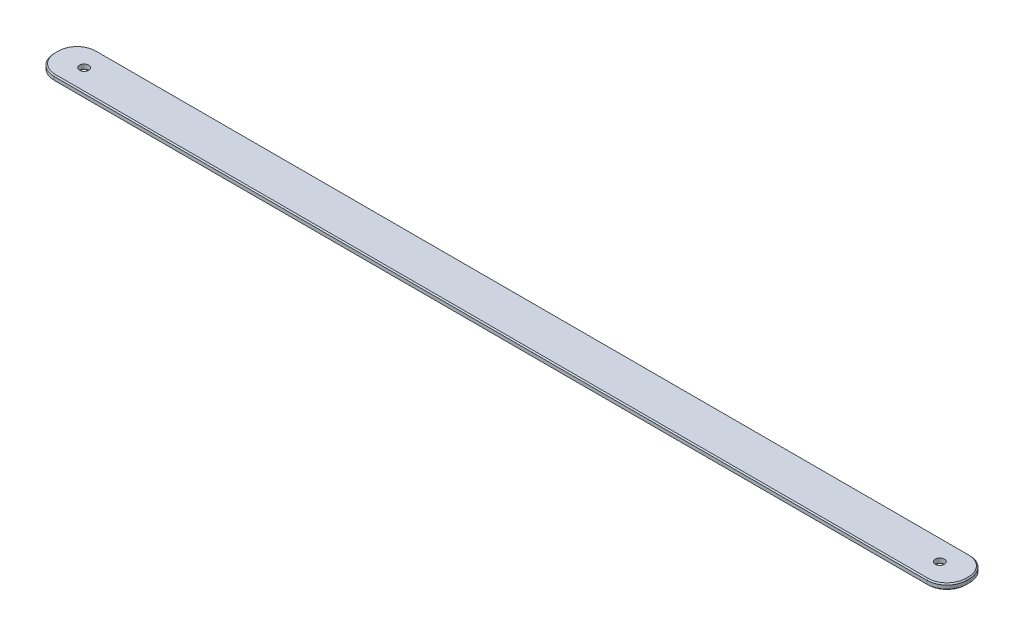
ISO-10303-21;
HEADER;
FILE_DESCRIPTION(('STEP AP214'),'2;1');
FILE_NAME('part.step','',(''),(''),'','','');
FILE_SCHEMA(('AUTOMOTIVE_DESIGN { 1 0 10303 214 1 1 1 1 }'));
ENDSEC;
DATA;
#1=APPLICATION_CONTEXT('core data for automotive mechanical design processes');
#2=APPLICATION_PROTOCOL_DEFINITION('international standard','automotive_design',2000,#1);
#3=PRODUCT_CONTEXT('',#1,'mechanical');
#4=PRODUCT('Part','Part','',(#3));
#5=PRODUCT_RELATED_PRODUCT_CATEGORY('part','',(#4));
#6=PRODUCT_DEFINITION_FORMATION('','',#4);
#7=PRODUCT_DEFINITION_CONTEXT('part definition',#1,'design');
#8=PRODUCT_DEFINITION('design','',#6,#7);
#9=PRODUCT_DEFINITION_SHAPE('','',#8);
#10=(LENGTH_UNIT() NAMED_UNIT(*) SI_UNIT(.MILLI.,.METRE.));
#11=(NAMED_UNIT(*) PLANE_ANGLE_UNIT() SI_UNIT($,.RADIAN.));
#12=(NAMED_UNIT(*) SI_UNIT($,.STERADIAN.) SOLID_ANGLE_UNIT());
#13=UNCERTAINTY_MEASURE_WITH_UNIT(LENGTH_MEASURE(1.E-05),#10,'distance_accuracy_value','');
#14=(GEOMETRIC_REPRESENTATION_CONTEXT(3) GLOBAL_UNCERTAINTY_ASSIGNED_CONTEXT((#13)) GLOBAL_UNIT_ASSIGNED_CONTEXT((#10,
#11,#12)) REPRESENTATION_CONTEXT('',''));
#15=CARTESIAN_POINT('',(0.,0.,0.));
#16=DIRECTION('',(0.,0.,1.));
#17=DIRECTION('',(1.,0.,0.));
#18=AXIS2_PLACEMENT_3D('',#15,#16,#17);
#19=CARTESIAN_POINT('',(0.,2.,0.));
#20=DIRECTION('',(1.,0.,0.));
#21=DIRECTION('',(0.,0.,-1.));
#22=AXIS2_PLACEMENT_3D('',#19,#20,#21);
#23=PLANE('',#22);
#24=DIRECTION('',(0.,-1.,0.));
#25=VECTOR('',#24,1.);
#26=CARTESIAN_POINT('',(0.,2.,-8.));
#27=LINE('',#26,#25);
#28=CARTESIAN_POINT('',(0.,1.59999999999999,-8.));
#29=VERTEX_POINT('',#28);
#30=CARTESIAN_POINT('',(0.,0.400000000000011,-8.));
#31=VERTEX_POINT('',#30);
#32=EDGE_CURVE('E301',#29,#31,#27,.T.);
#33=ORIENTED_EDGE('',*,*,#32,.T.);
#34=DIRECTION('',(0.,0.,1.));
#35=VECTOR('',#34,1.);
#36=CARTESIAN_POINT('',(0.,0.400000000000011,-7.));
#37=LINE('',#36,#35);
#38=CARTESIAN_POINT('',(0.,0.400000000000011,-7.));
#39=VERTEX_POINT('',#38);
#40=EDGE_CURVE('E192',#31,#39,#37,.T.);
#41=ORIENTED_EDGE('',*,*,#40,.T.);
#42=DIRECTION('',(0.,-1.,0.));
#43=VECTOR('',#42,1.);
#44=CARTESIAN_POINT('',(0.,2.,-7.));
#45=LINE('',#44,#43);
#46=CARTESIAN_POINT('',(0.,1.59999999999999,-7.));
#47=VERTEX_POINT('',#46);
#48=EDGE_CURVE('E310',#39,#47,#45,.F.);
#49=ORIENTED_EDGE('',*,*,#48,.T.);
#50=DIRECTION('',(0.,0.,-1.));
#51=VECTOR('',#50,1.);
#52=CARTESIAN_POINT('',(0.,1.59999999999999,0.));
#53=LINE('',#52,#51);
#54=EDGE_CURVE('E190',#47,#29,#53,.T.);
#55=ORIENTED_EDGE('',*,*,#54,.T.);
#56=EDGE_LOOP('',(#33,#41,#49,#55));
#57=FACE_BOUND('',#56,.T.);
#58=ADVANCED_FACE('F37',(#57),#23,.F.);
#59=CARTESIAN_POINT('',(0.,2.,0.));
#60=DIRECTION('',(0.,0.,-1.));
#61=DIRECTION('',(-1.,0.,0.));
#62=AXIS2_PLACEMENT_3D('',#59,#60,#61);
#63=PLANE('',#62);
#64=DIRECTION('',(0.,-1.,0.));
#65=VECTOR('',#64,1.);
#66=CARTESIAN_POINT('',(7.,2.,0.));
#67=LINE('',#66,#65);
#68=CARTESIAN_POINT('',(7.,1.59999999999999,0.));
#69=VERTEX_POINT('',#68);
#70=CARTESIAN_POINT('',(7.,0.400000000000011,0.));
#71=VERTEX_POINT('',#70);
#72=EDGE_CURVE('E290',#69,#71,#67,.T.);
#73=ORIENTED_EDGE('',*,*,#72,.T.);
#74=DIRECTION('',(1.,0.,0.));
#75=VECTOR('',#74,1.);
#76=CARTESIAN_POINT('',(313.,0.400000000000011,0.));
#77=LINE('',#76,#75);
#78=CARTESIAN_POINT('',(313.,0.400000000000011,0.));
#79=VERTEX_POINT('',#78);
#80=EDGE_CURVE('E200',#71,#79,#77,.T.);
#81=ORIENTED_EDGE('',*,*,#80,.T.);
#82=DIRECTION('',(0.,-1.,0.));
#83=VECTOR('',#82,1.);
#84=CARTESIAN_POINT('',(313.,2.,0.));
#85=LINE('',#84,#83);
#86=CARTESIAN_POINT('',(313.,1.59999999999999,0.));
#87=VERTEX_POINT('',#86);
#88=EDGE_CURVE('E293',#79,#87,#85,.F.);
#89=ORIENTED_EDGE('',*,*,#88,.T.);
#90=DIRECTION('',(-1.,0.,0.));
#91=VECTOR('',#90,1.);
#92=CARTESIAN_POINT('',(0.,1.59999999999999,0.));
#93=LINE('',#92,#91);
#94=EDGE_CURVE('E198',#87,#69,#93,.T.);
#95=ORIENTED_EDGE('',*,*,#94,.T.);
#96=EDGE_LOOP('',(#73,#81,#89,#95));
#97=FACE_BOUND('',#96,.T.);
#98=ADVANCED_FACE('F289',(#97),#63,.F.);
#99=CARTESIAN_POINT('',(320.,2.,0.));
#100=DIRECTION('',(-1.,0.,0.));
#101=DIRECTION('',(0.,0.,1.));
#102=AXIS2_PLACEMENT_3D('',#99,#100,#101);
#103=PLANE('',#102);
#104=DIRECTION('',(0.,-1.,0.));
#105=VECTOR('',#104,1.);
#106=CARTESIAN_POINT('',(320.,2.,-7.));
#107=LINE('',#106,#105);
#108=CARTESIAN_POINT('',(320.,1.59999999999999,-7.));
#109=VERTEX_POINT('',#108);
#110=CARTESIAN_POINT('',(320.,0.400000000000011,-7.));
#111=VERTEX_POINT('',#110);
#112=EDGE_CURVE('E304',#109,#111,#107,.T.);
#113=ORIENTED_EDGE('',*,*,#112,.T.);
#114=DIRECTION('',(0.,0.,-1.));
#115=VECTOR('',#114,1.);
#116=CARTESIAN_POINT('',(320.,0.400000000000011,-8.));
#117=LINE('',#116,#115);
#118=CARTESIAN_POINT('',(320.,0.400000000000011,-8.));
#119=VERTEX_POINT('',#118);
#120=EDGE_CURVE('E208',#111,#119,#117,.T.);
#121=ORIENTED_EDGE('',*,*,#120,.T.);
#122=DIRECTION('',(0.,-1.,0.));
#123=VECTOR('',#122,1.);
#124=CARTESIAN_POINT('',(320.,2.,-8.));
#125=LINE('',#124,#123);
#126=CARTESIAN_POINT('',(320.,1.59999999999999,-8.));
#127=VERTEX_POINT('',#126);
#128=EDGE_CURVE('E299',#119,#127,#125,.F.);
#129=ORIENTED_EDGE('',*,*,#128,.T.);
#130=DIRECTION('',(0.,0.,1.));
#131=VECTOR('',#130,1.);
#132=CARTESIAN_POINT('',(320.,1.59999999999999,0.));
#133=LINE('',#132,#131);
#134=EDGE_CURVE('E206',#127,#109,#133,.T.);
#135=ORIENTED_EDGE('',*,*,#134,.T.);
#136=EDGE_LOOP('',(#113,#121,#129,#135));
#137=FACE_BOUND('',#136,.T.);
#138=ADVANCED_FACE('F367',(#137),#103,.F.);
#139=CARTESIAN_POINT('',(0.,2.,-15.));
#140=DIRECTION('',(0.,0.,1.));
#141=DIRECTION('',(1.,0.,0.));
#142=AXIS2_PLACEMENT_3D('',#139,#140,#141);
#143=PLANE('',#142);
#144=DIRECTION('',(0.,-1.,0.));
#145=VECTOR('',#144,1.);
#146=CARTESIAN_POINT('',(313.,2.,-15.));
#147=LINE('',#146,#145);
#148=CARTESIAN_POINT('',(313.,1.59999999999999,-15.));
#149=VERTEX_POINT('',#148);
#150=CARTESIAN_POINT('',(313.,0.400000000000011,-15.));
#151=VERTEX_POINT('',#150);
#152=EDGE_CURVE('E352',#149,#151,#147,.T.);
#153=ORIENTED_EDGE('',*,*,#152,.T.);
#154=DIRECTION('',(-1.,0.,0.));
#155=VECTOR('',#154,1.);
#156=CARTESIAN_POINT('',(7.,0.400000000000011,-15.));
#157=LINE('',#156,#155);
#158=CARTESIAN_POINT('',(7.,0.400000000000011,-15.));
#159=VERTEX_POINT('',#158);
#160=EDGE_CURVE('E217',#151,#159,#157,.T.);
#161=ORIENTED_EDGE('',*,*,#160,.T.);
#162=DIRECTION('',(0.,-1.,0.));
#163=VECTOR('',#162,1.);
#164=CARTESIAN_POINT('',(7.,2.,-15.));
#165=LINE('',#164,#163);
#166=CARTESIAN_POINT('',(7.,1.59999999999999,-15.));
#167=VERTEX_POINT('',#166);
#168=EDGE_CURVE('E339',#159,#167,#165,.F.);
#169=ORIENTED_EDGE('',*,*,#168,.T.);
#170=DIRECTION('',(1.,0.,0.));
#171=VECTOR('',#170,1.);
#172=CARTESIAN_POINT('',(0.,1.59999999999999,-15.));
#173=LINE('',#172,#171);
#174=EDGE_CURVE('E214',#167,#149,#173,.T.);
#175=ORIENTED_EDGE('',*,*,#174,.T.);
#176=EDGE_LOOP('',(#153,#161,#169,#175));
#177=FACE_BOUND('',#176,.T.);
#178=ADVANCED_FACE('F350',(#177),#143,.F.);
#179=CARTESIAN_POINT('',(0.,2.,0.));
#180=DIRECTION('',(0.,-1.,0.));
#181=DIRECTION('',(0.,0.,-1.));
#182=AXIS2_PLACEMENT_3D('',#179,#180,#181);
#183=PLANE('',#182);
#184=CARTESIAN_POINT('',(313.,2.,-8.));
#185=DIRECTION('',(0.,-1.,0.));
#186=DIRECTION('',(0.,0.,-1.));
#187=AXIS2_PLACEMENT_3D('',#184,#185,#186);
#188=CIRCLE('',#187,6.59999999999999);
#189=CARTESIAN_POINT('',(319.6,2.,-8.));
#190=VERTEX_POINT('',#189);
#191=CARTESIAN_POINT('',(313.,2.,-14.6));
#192=VERTEX_POINT('',#191);
#193=EDGE_CURVE('E62',#190,#192,#188,.F.);
#194=ORIENTED_EDGE('',*,*,#193,.T.);
#195=DIRECTION('',(-1.,0.,0.));
#196=VECTOR('',#195,1.);
#197=CARTESIAN_POINT('',(0.,2.,-14.6));
#198=LINE('',#197,#196);
#199=CARTESIAN_POINT('',(7.,2.,-14.6));
#200=VERTEX_POINT('',#199);
#201=EDGE_CURVE('E11',#192,#200,#198,.T.);
#202=ORIENTED_EDGE('',*,*,#201,.T.);
#203=CARTESIAN_POINT('',(7.,2.,-8.));
#204=DIRECTION('',(0.,-1.,0.));
#205=DIRECTION('',(0.,0.,-1.));
#206=AXIS2_PLACEMENT_3D('',#203,#204,#205);
#207=CIRCLE('',#206,6.59999999999999);
#208=CARTESIAN_POINT('',(0.400000000000011,2.,-8.));
#209=VERTEX_POINT('',#208);
#210=EDGE_CURVE('E47',#200,#209,#207,.F.);
#211=ORIENTED_EDGE('',*,*,#210,.T.);
#212=DIRECTION('',(0.,0.,1.));
#213=VECTOR('',#212,1.);
#214=CARTESIAN_POINT('',(0.400000000000011,2.,0.));
#215=LINE('',#214,#213);
#216=CARTESIAN_POINT('',(0.400000000000011,2.,-7.));
#217=VERTEX_POINT('',#216);
#218=EDGE_CURVE('E233',#209,#217,#215,.T.);
#219=ORIENTED_EDGE('',*,*,#218,.T.);
#220=CARTESIAN_POINT('',(7.,2.,-7.));
#221=DIRECTION('',(0.,-1.,0.));
#222=DIRECTION('',(0.,0.,-1.));
#223=AXIS2_PLACEMENT_3D('',#220,#221,#222);
#224=CIRCLE('',#223,6.59999999999999);
#225=CARTESIAN_POINT('',(7.,2.,-0.400000000000011));
#226=VERTEX_POINT('',#225);
#227=EDGE_CURVE('E229',#217,#226,#224,.F.);
#228=ORIENTED_EDGE('',*,*,#227,.T.);
#229=DIRECTION('',(1.,0.,0.));
#230=VECTOR('',#229,1.);
#231=CARTESIAN_POINT('',(0.,2.,-0.400000000000011));
#232=LINE('',#231,#230);
#233=CARTESIAN_POINT('',(313.,2.,-0.400000000000011));
#234=VERTEX_POINT('',#233);
#235=EDGE_CURVE('E225',#226,#234,#232,.T.);
#236=ORIENTED_EDGE('',*,*,#235,.T.);
#237=CARTESIAN_POINT('',(313.,2.,-7.));
#238=DIRECTION('',(0.,-1.,0.));
#239=DIRECTION('',(0.,0.,-1.));
#240=AXIS2_PLACEMENT_3D('',#237,#238,#239);
#241=CIRCLE('',#240,6.59999999999999);
#242=CARTESIAN_POINT('',(319.6,2.,-7.));
#243=VERTEX_POINT('',#242);
#244=EDGE_CURVE('E227',#234,#243,#241,.F.);
#245=ORIENTED_EDGE('',*,*,#244,.T.);
#246=DIRECTION('',(0.,0.,-1.));
#247=VECTOR('',#246,1.);
#248=CARTESIAN_POINT('',(319.6,2.,0.));
#249=LINE('',#248,#247);
#250=EDGE_CURVE('E231',#243,#190,#249,.T.);
#251=ORIENTED_EDGE('',*,*,#250,.T.);
#252=EDGE_LOOP('',(#194,#202,#211,#219,#228,#236,#245,#251));
#253=FACE_BOUND('',#252,.T.);
#254=CARTESIAN_POINT('',(10.,2.,-7.5));
#255=DIRECTION('',(0.,1.,0.));
#256=DIRECTION('',(0.,0.,1.));
#257=AXIS2_PLACEMENT_3D('',#254,#255,#256);
#258=CIRCLE('',#257,1.6);
#259=CARTESIAN_POINT('',(10.,2.,-5.9));
#260=VERTEX_POINT('',#259);
#261=EDGE_CURVE('E353',#260,#260,#258,.T.);
#262=ORIENTED_EDGE('',*,*,#261,.F.);
#263=EDGE_LOOP('',(#262));
#264=FACE_BOUND('',#263,.T.);
#265=CARTESIAN_POINT('',(310.,2.,-7.5));
#266=DIRECTION('',(0.,1.,0.));
#267=DIRECTION('',(0.,0.,1.));
#268=AXIS2_PLACEMENT_3D('',#265,#266,#267);
#269=CIRCLE('',#268,1.59999999999996);
#270=CARTESIAN_POINT('',(310.,2.,-5.90000000000003));
#271=VERTEX_POINT('',#270);
#272=EDGE_CURVE('E254',#271,#271,#269,.T.);
#273=ORIENTED_EDGE('',*,*,#272,.F.);
#274=EDGE_LOOP('',(#273));
#275=FACE_BOUND('',#274,.T.);
#276=ADVANCED_FACE('F373',(#253,#264,#275),#183,.F.);
#277=CARTESIAN_POINT('',(0.,0.,0.));
#278=DIRECTION('',(0.,-1.,0.));
#279=DIRECTION('',(0.,0.,-1.));
#280=AXIS2_PLACEMENT_3D('',#277,#278,#279);
#281=PLANE('',#280);
#282=DIRECTION('',(0.,0.,-1.));
#283=VECTOR('',#282,1.);
#284=CARTESIAN_POINT('',(0.400000000000012,0.,-8.));
#285=LINE('',#284,#283);
#286=CARTESIAN_POINT('',(0.400000000000012,0.,-7.));
#287=VERTEX_POINT('',#286);
#288=CARTESIAN_POINT('',(0.400000000000012,0.,-8.));
#289=VERTEX_POINT('',#288);
#290=EDGE_CURVE('E180',#287,#289,#285,.T.);
#291=ORIENTED_EDGE('',*,*,#290,.T.);
#292=CARTESIAN_POINT('',(7.,0.,-8.));
#293=DIRECTION('',(0.,-1.,0.));
#294=DIRECTION('',(0.,0.,-1.));
#295=AXIS2_PLACEMENT_3D('',#292,#293,#294);
#296=CIRCLE('',#295,6.59999999999999);
#297=CARTESIAN_POINT('',(7.,0.,-14.6));
#298=VERTEX_POINT('',#297);
#299=EDGE_CURVE('E160',#289,#298,#296,.T.);
#300=ORIENTED_EDGE('',*,*,#299,.T.);
#301=DIRECTION('',(1.,0.,0.));
#302=VECTOR('',#301,1.);
#303=CARTESIAN_POINT('',(313.,0.,-14.6));
#304=LINE('',#303,#302);
#305=CARTESIAN_POINT('',(313.,0.,-14.6));
#306=VERTEX_POINT('',#305);
#307=EDGE_CURVE('E168',#298,#306,#304,.T.);
#308=ORIENTED_EDGE('',*,*,#307,.T.);
#309=CARTESIAN_POINT('',(313.,0.,-8.));
#310=DIRECTION('',(0.,-1.,0.));
#311=DIRECTION('',(0.,0.,-1.));
#312=AXIS2_PLACEMENT_3D('',#309,#310,#311);
#313=CIRCLE('',#312,6.59999999999999);
#314=CARTESIAN_POINT('',(319.6,0.,-8.));
#315=VERTEX_POINT('',#314);
#316=EDGE_CURVE('E174',#306,#315,#313,.T.);
#317=ORIENTED_EDGE('',*,*,#316,.T.);
#318=DIRECTION('',(0.,0.,1.));
#319=VECTOR('',#318,1.);
#320=CARTESIAN_POINT('',(319.6,0.,-7.));
#321=LINE('',#320,#319);
#322=CARTESIAN_POINT('',(319.6,0.,-7.));
#323=VERTEX_POINT('',#322);
#324=EDGE_CURVE('E318',#315,#323,#321,.T.);
#325=ORIENTED_EDGE('',*,*,#324,.T.);
#326=CARTESIAN_POINT('',(313.,0.,-7.));
#327=DIRECTION('',(0.,-1.,0.));
#328=DIRECTION('',(0.,0.,-1.));
#329=AXIS2_PLACEMENT_3D('',#326,#327,#328);
#330=CIRCLE('',#329,6.59999999999999);
#331=CARTESIAN_POINT('',(313.,0.,-0.400000000000005));
#332=VERTEX_POINT('',#331);
#333=EDGE_CURVE('E320',#323,#332,#330,.T.);
#334=ORIENTED_EDGE('',*,*,#333,.T.);
#335=DIRECTION('',(-1.,0.,0.));
#336=VECTOR('',#335,1.);
#337=CARTESIAN_POINT('',(7.,0.,-0.400000000000012));
#338=LINE('',#337,#336);
#339=CARTESIAN_POINT('',(7.,0.,-0.400000000000012));
#340=VERTEX_POINT('',#339);
#341=EDGE_CURVE('E322',#332,#340,#338,.T.);
#342=ORIENTED_EDGE('',*,*,#341,.T.);
#343=CARTESIAN_POINT('',(7.,0.,-7.));
#344=DIRECTION('',(0.,-1.,0.));
#345=DIRECTION('',(0.,0.,-1.));
#346=AXIS2_PLACEMENT_3D('',#343,#344,#345);
#347=CIRCLE('',#346,6.59999999999999);
#348=EDGE_CURVE('E185',#340,#287,#347,.T.);
#349=ORIENTED_EDGE('',*,*,#348,.T.);
#350=EDGE_LOOP('',(#291,#300,#308,#317,#325,#334,#342,#349));
#351=FACE_BOUND('',#350,.T.);
#352=CARTESIAN_POINT('',(310.,0.,-7.5));
#353=DIRECTION('',(0.,-1.,0.));
#354=DIRECTION('',(0.,0.,-1.));
#355=AXIS2_PLACEMENT_3D('',#352,#353,#354);
#356=CIRCLE('',#355,1.99999999999992);
#357=CARTESIAN_POINT('',(310.,0.,-9.49999999999992));
#358=VERTEX_POINT('',#357);
#359=EDGE_CURVE('E175',#358,#358,#356,.F.);
#360=ORIENTED_EDGE('',*,*,#359,.T.);
#361=EDGE_LOOP('',(#360));
#362=FACE_BOUND('',#361,.T.);
#363=CARTESIAN_POINT('',(10.,0.,-7.5));
#364=DIRECTION('',(0.,-1.,0.));
#365=DIRECTION('',(0.,0.,-1.));
#366=AXIS2_PLACEMENT_3D('',#363,#364,#365);
#367=CIRCLE('',#366,1.99999999999997);
#368=CARTESIAN_POINT('',(10.,0.,-9.49999999999997));
#369=VERTEX_POINT('',#368);
#370=EDGE_CURVE('E312',#369,#369,#367,.F.);
#371=ORIENTED_EDGE('',*,*,#370,.T.);
#372=EDGE_LOOP('',(#371));
#373=FACE_BOUND('',#372,.T.);
#374=ADVANCED_FACE('F177',(#351,#362,#373),#281,.T.);
#375=CARTESIAN_POINT('',(310.,0.,-7.5));
#376=DIRECTION('',(0.,1.,0.));
#377=DIRECTION('',(0.,0.,1.));
#378=AXIS2_PLACEMENT_3D('',#375,#376,#377);
#379=CYLINDRICAL_SURFACE('',#378,1.59999999999996);
#380=CARTESIAN_POINT('',(310.,0.399999999999946,-7.5));
#381=DIRECTION('',(0.,-1.,0.));
#382=DIRECTION('',(0.,0.,-1.));
#383=AXIS2_PLACEMENT_3D('',#380,#381,#382);
#384=CIRCLE('',#383,1.59999999999996);
#385=CARTESIAN_POINT('',(310.,0.399999999999946,-9.09999999999996));
#386=VERTEX_POINT('',#385);
#387=EDGE_CURVE('E219',#386,#386,#384,.T.);
#388=ORIENTED_EDGE('',*,*,#387,.T.);
#389=EDGE_LOOP('',(#388));
#390=FACE_BOUND('',#389,.T.);
#391=ORIENTED_EDGE('',*,*,#272,.T.);
#392=EDGE_LOOP('',(#391));
#393=FACE_BOUND('',#392,.T.);
#394=ADVANCED_FACE('F615',(#390,#393),#379,.F.);
#395=CARTESIAN_POINT('',(10.,0.,-7.5));
#396=DIRECTION('',(0.,1.,0.));
#397=DIRECTION('',(0.,0.,1.));
#398=AXIS2_PLACEMENT_3D('',#395,#396,#397);
#399=CYLINDRICAL_SURFACE('',#398,1.6);
#400=CARTESIAN_POINT('',(10.,0.399999999999992,-7.5));
#401=DIRECTION('',(0.,-1.,0.));
#402=DIRECTION('',(0.,0.,-1.));
#403=AXIS2_PLACEMENT_3D('',#400,#401,#402);
#404=CIRCLE('',#403,1.6);
#405=CARTESIAN_POINT('',(10.,0.399999999999992,-9.1));
#406=VERTEX_POINT('',#405);
#407=EDGE_CURVE('E222',#406,#406,#404,.T.);
#408=ORIENTED_EDGE('',*,*,#407,.T.);
#409=EDGE_LOOP('',(#408));
#410=FACE_BOUND('',#409,.T.);
#411=ORIENTED_EDGE('',*,*,#261,.T.);
#412=EDGE_LOOP('',(#411));
#413=FACE_BOUND('',#412,.T.);
#414=ADVANCED_FACE('F395',(#410,#413),#399,.F.);
#415=CARTESIAN_POINT('',(313.,2.,-8.));
#416=DIRECTION('',(0.,-1.,0.));
#417=DIRECTION('',(0.,0.,-1.));
#418=AXIS2_PLACEMENT_3D('',#415,#416,#417);
#419=CYLINDRICAL_SURFACE('',#418,7.);
#420=ORIENTED_EDGE('',*,*,#128,.F.);
#421=CARTESIAN_POINT('',(313.,0.400000000000011,-8.));
#422=DIRECTION('',(0.,-1.,0.));
#423=DIRECTION('',(0.,0.,-1.));
#424=AXIS2_PLACEMENT_3D('',#421,#422,#423);
#425=CIRCLE('',#424,7.);
#426=EDGE_CURVE('E212',#119,#151,#425,.F.);
#427=ORIENTED_EDGE('',*,*,#426,.T.);
#428=ORIENTED_EDGE('',*,*,#152,.F.);
#429=CARTESIAN_POINT('',(313.,1.59999999999999,-8.));
#430=DIRECTION('',(0.,-1.,0.));
#431=DIRECTION('',(0.,0.,-1.));
#432=AXIS2_PLACEMENT_3D('',#429,#430,#431);
#433=CIRCLE('',#432,7.);
#434=EDGE_CURVE('E210',#149,#127,#433,.T.);
#435=ORIENTED_EDGE('',*,*,#434,.T.);
#436=EDGE_LOOP('',(#420,#427,#428,#435));
#437=FACE_BOUND('',#436,.T.);
#438=ADVANCED_FACE('F362',(#437),#419,.T.);
#439=CARTESIAN_POINT('',(313.,2.,-7.));
#440=DIRECTION('',(0.,-1.,0.));
#441=DIRECTION('',(0.,0.,-1.));
#442=AXIS2_PLACEMENT_3D('',#439,#440,#441);
#443=CYLINDRICAL_SURFACE('',#442,7.);
#444=ORIENTED_EDGE('',*,*,#88,.F.);
#445=CARTESIAN_POINT('',(313.,0.400000000000011,-7.));
#446=DIRECTION('',(0.,-1.,0.));
#447=DIRECTION('',(0.,0.,-1.));
#448=AXIS2_PLACEMENT_3D('',#445,#446,#447);
#449=CIRCLE('',#448,7.);
#450=EDGE_CURVE('E204',#79,#111,#449,.F.);
#451=ORIENTED_EDGE('',*,*,#450,.T.);
#452=ORIENTED_EDGE('',*,*,#112,.F.);
#453=CARTESIAN_POINT('',(313.,1.59999999999999,-7.));
#454=DIRECTION('',(0.,-1.,0.));
#455=DIRECTION('',(0.,0.,-1.));
#456=AXIS2_PLACEMENT_3D('',#453,#454,#455);
#457=CIRCLE('',#456,7.);
#458=EDGE_CURVE('E202',#109,#87,#457,.T.);
#459=ORIENTED_EDGE('',*,*,#458,.T.);
#460=EDGE_LOOP('',(#444,#451,#452,#459));
#461=FACE_BOUND('',#460,.T.);
#462=ADVANCED_FACE('F394',(#461),#443,.T.);
#463=CARTESIAN_POINT('',(7.,2.,-7.));
#464=DIRECTION('',(0.,-1.,0.));
#465=DIRECTION('',(0.,0.,-1.));
#466=AXIS2_PLACEMENT_3D('',#463,#464,#465);
#467=CYLINDRICAL_SURFACE('',#466,7.);
#468=ORIENTED_EDGE('',*,*,#48,.F.);
#469=CARTESIAN_POINT('',(7.,0.400000000000011,-7.));
#470=DIRECTION('',(0.,-1.,0.));
#471=DIRECTION('',(0.,0.,-1.));
#472=AXIS2_PLACEMENT_3D('',#469,#470,#471);
#473=CIRCLE('',#472,7.);
#474=EDGE_CURVE('E196',#39,#71,#473,.F.);
#475=ORIENTED_EDGE('',*,*,#474,.T.);
#476=ORIENTED_EDGE('',*,*,#72,.F.);
#477=CARTESIAN_POINT('',(7.,1.59999999999999,-7.));
#478=DIRECTION('',(0.,-1.,0.));
#479=DIRECTION('',(0.,0.,-1.));
#480=AXIS2_PLACEMENT_3D('',#477,#478,#479);
#481=CIRCLE('',#480,7.);
#482=EDGE_CURVE('E194',#69,#47,#481,.T.);
#483=ORIENTED_EDGE('',*,*,#482,.T.);
#484=EDGE_LOOP('',(#468,#475,#476,#483));
#485=FACE_BOUND('',#484,.T.);
#486=ADVANCED_FACE('F296',(#485),#467,.T.);
#487=CARTESIAN_POINT('',(7.,2.,-8.));
#488=DIRECTION('',(0.,-1.,0.));
#489=DIRECTION('',(0.,0.,-1.));
#490=AXIS2_PLACEMENT_3D('',#487,#488,#489);
#491=CYLINDRICAL_SURFACE('',#490,7.);
#492=ORIENTED_EDGE('',*,*,#168,.F.);
#493=CARTESIAN_POINT('',(7.,0.400000000000011,-8.));
#494=DIRECTION('',(0.,-1.,0.));
#495=DIRECTION('',(0.,0.,-1.));
#496=AXIS2_PLACEMENT_3D('',#493,#494,#495);
#497=CIRCLE('',#496,7.);
#498=EDGE_CURVE('E162',#159,#31,#497,.F.);
#499=ORIENTED_EDGE('',*,*,#498,.T.);
#500=ORIENTED_EDGE('',*,*,#32,.F.);
#501=CARTESIAN_POINT('',(7.,1.59999999999999,-8.));
#502=DIRECTION('',(0.,-1.,0.));
#503=DIRECTION('',(0.,0.,-1.));
#504=AXIS2_PLACEMENT_3D('',#501,#502,#503);
#505=CIRCLE('',#504,7.);
#506=EDGE_CURVE('E182',#29,#167,#505,.T.);
#507=ORIENTED_EDGE('',*,*,#506,.T.);
#508=EDGE_LOOP('',(#492,#499,#500,#507));
#509=FACE_BOUND('',#508,.T.);
#510=ADVANCED_FACE('F336',(#509),#491,.T.);
#511=CARTESIAN_POINT('',(313.,0.,-7.));
#512=DIRECTION('',(0.,1.,0.));
#513=DIRECTION('',(0.,0.,1.));
#514=AXIS2_PLACEMENT_3D('',#511,#512,#513);
#515=CONICAL_SURFACE('',#514,6.59999999999999,0.785398163397441);
#516=DIRECTION('',(-0.707106781186548,-0.707106781186548,0.));
#517=VECTOR('',#516,1.);
#518=CARTESIAN_POINT('',(320.,0.400000000000011,-7.));
#519=LINE('',#518,#517);
#520=EDGE_CURVE('E248',#111,#323,#519,.T.);
#521=ORIENTED_EDGE('',*,*,#520,.F.);
#522=ORIENTED_EDGE('',*,*,#450,.F.);
#523=DIRECTION('',(0.,0.707106781186553,0.707106781186542));
#524=VECTOR('',#523,1.);
#525=CARTESIAN_POINT('',(313.,0.,-0.400000000000005));
#526=LINE('',#525,#524);
#527=EDGE_CURVE('E251',#332,#79,#526,.T.);
#528=ORIENTED_EDGE('',*,*,#527,.F.);
#529=ORIENTED_EDGE('',*,*,#333,.F.);
#530=EDGE_LOOP('',(#521,#522,#528,#529));
#531=FACE_BOUND('',#530,.T.);
#532=ADVANCED_FACE('F403',(#531),#515,.T.);
#533=CARTESIAN_POINT('',(0.,0.400000000000011,0.));
#534=DIRECTION('',(0.,-0.707106781186548,0.707106781186548));
#535=DIRECTION('',(-1.,0.,0.));
#536=AXIS2_PLACEMENT_3D('',#533,#534,#535);
#537=PLANE('',#536);
#538=ORIENTED_EDGE('',*,*,#527,.T.);
#539=ORIENTED_EDGE('',*,*,#80,.F.);
#540=DIRECTION('',(0.,0.707106781186547,0.707106781186548));
#541=VECTOR('',#540,1.);
#542=CARTESIAN_POINT('',(7.,0.,-0.400000000000012));
#543=LINE('',#542,#541);
#544=EDGE_CURVE('E245',#340,#71,#543,.T.);
#545=ORIENTED_EDGE('',*,*,#544,.F.);
#546=ORIENTED_EDGE('',*,*,#341,.F.);
#547=EDGE_LOOP('',(#538,#539,#545,#546));
#548=FACE_BOUND('',#547,.T.);
#549=ADVANCED_FACE('F440',(#548),#537,.T.);
#550=CARTESIAN_POINT('',(320.,0.400000000000011,0.));
#551=DIRECTION('',(0.707106781186548,-0.707106781186548,0.));
#552=DIRECTION('',(0.,0.,1.));
#553=AXIS2_PLACEMENT_3D('',#550,#551,#552);
#554=PLANE('',#553);
#555=ORIENTED_EDGE('',*,*,#520,.T.);
#556=ORIENTED_EDGE('',*,*,#324,.F.);
#557=DIRECTION('',(-0.707106781186548,-0.707106781186548,0.));
#558=VECTOR('',#557,1.);
#559=CARTESIAN_POINT('',(320.,0.400000000000011,-8.));
#560=LINE('',#559,#558);
#561=EDGE_CURVE('E242',#119,#315,#560,.T.);
#562=ORIENTED_EDGE('',*,*,#561,.F.);
#563=ORIENTED_EDGE('',*,*,#120,.F.);
#564=EDGE_LOOP('',(#555,#556,#562,#563));
#565=FACE_BOUND('',#564,.T.);
#566=ADVANCED_FACE('F434',(#565),#554,.T.);
#567=CARTESIAN_POINT('',(7.,0.,-7.));
#568=DIRECTION('',(0.,1.,0.));
#569=DIRECTION('',(0.,0.,1.));
#570=AXIS2_PLACEMENT_3D('',#567,#568,#569);
#571=CONICAL_SURFACE('',#570,6.59999999999999,0.785398163397448);
#572=ORIENTED_EDGE('',*,*,#544,.T.);
#573=ORIENTED_EDGE('',*,*,#474,.F.);
#574=DIRECTION('',(-0.707106781186548,0.707106781186548,0.));
#575=VECTOR('',#574,1.);
#576=CARTESIAN_POINT('',(0.400000000000012,0.,-7.));
#577=LINE('',#576,#575);
#578=EDGE_CURVE('E239',#287,#39,#577,.T.);
#579=ORIENTED_EDGE('',*,*,#578,.F.);
#580=ORIENTED_EDGE('',*,*,#348,.F.);
#581=EDGE_LOOP('',(#572,#573,#579,#580));
#582=FACE_BOUND('',#581,.T.);
#583=ADVANCED_FACE('F328',(#582),#571,.T.);
#584=CARTESIAN_POINT('',(313.,0.,-8.));
#585=DIRECTION('',(0.,1.,0.));
#586=DIRECTION('',(0.,0.,1.));
#587=AXIS2_PLACEMENT_3D('',#584,#585,#586);
#588=CONICAL_SURFACE('',#587,6.59999999999999,0.785398163397449);
#589=ORIENTED_EDGE('',*,*,#561,.T.);
#590=ORIENTED_EDGE('',*,*,#316,.F.);
#591=DIRECTION('',(0.,-0.707106781186554,0.707106781186541));
#592=VECTOR('',#591,1.);
#593=CARTESIAN_POINT('',(313.,0.400000000000011,-15.));
#594=LINE('',#593,#592);
#595=EDGE_CURVE('E171',#151,#306,#594,.T.);
#596=ORIENTED_EDGE('',*,*,#595,.F.);
#597=ORIENTED_EDGE('',*,*,#426,.F.);
#598=EDGE_LOOP('',(#589,#590,#596,#597));
#599=FACE_BOUND('',#598,.T.);
#600=ADVANCED_FACE('F422',(#599),#588,.T.);
#601=CARTESIAN_POINT('',(0.,0.400000000000011,0.));
#602=DIRECTION('',(-0.707106781186548,-0.707106781186548,0.));
#603=DIRECTION('',(0.,0.,-1.));
#604=AXIS2_PLACEMENT_3D('',#601,#602,#603);
#605=PLANE('',#604);
#606=ORIENTED_EDGE('',*,*,#578,.T.);
#607=ORIENTED_EDGE('',*,*,#40,.F.);
#608=DIRECTION('',(-0.707106781186548,0.707106781186547,0.));
#609=VECTOR('',#608,1.);
#610=CARTESIAN_POINT('',(0.400000000000012,0.,-8.));
#611=LINE('',#610,#609);
#612=EDGE_CURVE('E165',#289,#31,#611,.T.);
#613=ORIENTED_EDGE('',*,*,#612,.F.);
#614=ORIENTED_EDGE('',*,*,#290,.F.);
#615=EDGE_LOOP('',(#606,#607,#613,#614));
#616=FACE_BOUND('',#615,.T.);
#617=ADVANCED_FACE('F331',(#616),#605,.T.);
#618=CARTESIAN_POINT('',(0.,0.400000000000011,-15.));
#619=DIRECTION('',(0.,-0.707106781186548,-0.707106781186548));
#620=DIRECTION('',(1.,0.,0.));
#621=AXIS2_PLACEMENT_3D('',#618,#619,#620);
#622=PLANE('',#621);
#623=ORIENTED_EDGE('',*,*,#595,.T.);
#624=ORIENTED_EDGE('',*,*,#307,.F.);
#625=DIRECTION('',(0.,-0.707106781186548,0.707106781186548));
#626=VECTOR('',#625,1.);
#627=CARTESIAN_POINT('',(7.,0.400000000000011,-15.));
#628=LINE('',#627,#626);
#629=EDGE_CURVE('E156',#159,#298,#628,.T.);
#630=ORIENTED_EDGE('',*,*,#629,.F.);
#631=ORIENTED_EDGE('',*,*,#160,.F.);
#632=EDGE_LOOP('',(#623,#624,#630,#631));
#633=FACE_BOUND('',#632,.T.);
#634=ADVANCED_FACE('F169',(#633),#622,.T.);
#635=CARTESIAN_POINT('',(7.,0.,-8.));
#636=DIRECTION('',(0.,1.,0.));
#637=DIRECTION('',(0.,0.,1.));
#638=AXIS2_PLACEMENT_3D('',#635,#636,#637);
#639=CONICAL_SURFACE('',#638,6.59999999999999,0.785398163397448);
#640=ORIENTED_EDGE('',*,*,#612,.T.);
#641=ORIENTED_EDGE('',*,*,#498,.F.);
#642=ORIENTED_EDGE('',*,*,#629,.T.);
#643=ORIENTED_EDGE('',*,*,#299,.F.);
#644=EDGE_LOOP('',(#640,#641,#642,#643));
#645=FACE_BOUND('',#644,.T.);
#646=ADVANCED_FACE('F158',(#645),#639,.T.);
#647=CARTESIAN_POINT('',(310.,0.,-7.5));
#648=DIRECTION('',(0.,-1.,0.));
#649=DIRECTION('',(0.,0.,-1.));
#650=AXIS2_PLACEMENT_3D('',#647,#648,#649);
#651=CONICAL_SURFACE('',#650,1.99999999999992,0.785398163397459);
#652=ORIENTED_EDGE('',*,*,#387,.F.);
#653=EDGE_LOOP('',(#652));
#654=FACE_BOUND('',#653,.T.);
#655=ORIENTED_EDGE('',*,*,#359,.F.);
#656=EDGE_LOOP('',(#655));
#657=FACE_BOUND('',#656,.T.);
#658=ADVANCED_FACE('F411',(#654,#657),#651,.F.);
#659=CARTESIAN_POINT('',(10.,0.,-7.5));
#660=DIRECTION('',(0.,-1.,0.));
#661=DIRECTION('',(0.,0.,-1.));
#662=AXIS2_PLACEMENT_3D('',#659,#660,#661);
#663=CONICAL_SURFACE('',#662,1.99999999999997,0.785398163397424);
#664=ORIENTED_EDGE('',*,*,#407,.F.);
#665=EDGE_LOOP('',(#664));
#666=FACE_BOUND('',#665,.T.);
#667=ORIENTED_EDGE('',*,*,#370,.F.);
#668=EDGE_LOOP('',(#667));
#669=FACE_BOUND('',#668,.T.);
#670=ADVANCED_FACE('F458',(#666,#669),#663,.F.);
#671=CARTESIAN_POINT('',(0.,2.,-0.400000000000011));
#672=DIRECTION('',(0.,-0.707106781186548,-0.707106781186548));
#673=DIRECTION('',(1.,0.,0.));
#674=AXIS2_PLACEMENT_3D('',#671,#672,#673);
#675=PLANE('',#674);
#676=DIRECTION('',(0.,0.707106781186548,-0.707106781186548));
#677=VECTOR('',#676,1.);
#678=CARTESIAN_POINT('',(7.,1.59999999999999,0.));
#679=LINE('',#678,#677);
#680=EDGE_CURVE('E269',#69,#226,#679,.T.);
#681=ORIENTED_EDGE('',*,*,#680,.F.);
#682=ORIENTED_EDGE('',*,*,#94,.F.);
#683=DIRECTION('',(0.,-0.707106781186548,0.707106781186548));
#684=VECTOR('',#683,1.);
#685=CARTESIAN_POINT('',(313.,2.,-0.400000000000011));
#686=LINE('',#685,#684);
#687=EDGE_CURVE('E42',#234,#87,#686,.T.);
#688=ORIENTED_EDGE('',*,*,#687,.F.);
#689=ORIENTED_EDGE('',*,*,#235,.F.);
#690=EDGE_LOOP('',(#681,#682,#688,#689));
#691=FACE_BOUND('',#690,.T.);
#692=ADVANCED_FACE('F40',(#691),#675,.F.);
#693=CARTESIAN_POINT('',(313.,2.,-7.));
#694=DIRECTION('',(0.,-1.,0.));
#695=DIRECTION('',(0.,0.,-1.));
#696=AXIS2_PLACEMENT_3D('',#693,#694,#695);
#697=CONICAL_SURFACE('',#696,6.59999999999999,0.785398163397441);
#698=ORIENTED_EDGE('',*,*,#687,.T.);
#699=ORIENTED_EDGE('',*,*,#458,.F.);
#700=DIRECTION('',(0.707106781186548,-0.707106781186548,0.));
#701=VECTOR('',#700,1.);
#702=CARTESIAN_POINT('',(319.6,2.,-7.));
#703=LINE('',#702,#701);
#704=EDGE_CURVE('E267',#243,#109,#703,.T.);
#705=ORIENTED_EDGE('',*,*,#704,.F.);
#706=ORIENTED_EDGE('',*,*,#244,.F.);
#707=EDGE_LOOP('',(#698,#699,#705,#706));
#708=FACE_BOUND('',#707,.T.);
#709=ADVANCED_FACE('F280',(#708),#697,.T.);
#710=CARTESIAN_POINT('',(7.,2.,-7.));
#711=DIRECTION('',(0.,-1.,0.));
#712=DIRECTION('',(0.,0.,-1.));
#713=AXIS2_PLACEMENT_3D('',#710,#711,#712);
#714=CONICAL_SURFACE('',#713,6.59999999999999,0.785398163397448);
#715=ORIENTED_EDGE('',*,*,#680,.T.);
#716=ORIENTED_EDGE('',*,*,#227,.F.);
#717=DIRECTION('',(0.707106781186548,0.707106781186548,0.));
#718=VECTOR('',#717,1.);
#719=CARTESIAN_POINT('',(0.,1.59999999999999,-7.));
#720=LINE('',#719,#718);
#721=EDGE_CURVE('E264',#47,#217,#720,.T.);
#722=ORIENTED_EDGE('',*,*,#721,.F.);
#723=ORIENTED_EDGE('',*,*,#482,.F.);
#724=EDGE_LOOP('',(#715,#716,#722,#723));
#725=FACE_BOUND('',#724,.T.);
#726=ADVANCED_FACE('F375',(#725),#714,.T.);
#727=CARTESIAN_POINT('',(319.6,2.,0.));
#728=DIRECTION('',(-0.707106781186548,-0.707106781186548,0.));
#729=DIRECTION('',(0.,0.,-1.));
#730=AXIS2_PLACEMENT_3D('',#727,#728,#729);
#731=PLANE('',#730);
#732=ORIENTED_EDGE('',*,*,#704,.T.);
#733=ORIENTED_EDGE('',*,*,#134,.F.);
#734=DIRECTION('',(0.707106781186548,-0.707106781186548,0.));
#735=VECTOR('',#734,1.);
#736=CARTESIAN_POINT('',(319.6,2.,-8.));
#737=LINE('',#736,#735);
#738=EDGE_CURVE('E261',#190,#127,#737,.T.);
#739=ORIENTED_EDGE('',*,*,#738,.F.);
#740=ORIENTED_EDGE('',*,*,#250,.F.);
#741=EDGE_LOOP('',(#732,#733,#739,#740));
#742=FACE_BOUND('',#741,.T.);
#743=ADVANCED_FACE('F371',(#742),#731,.F.);
#744=CARTESIAN_POINT('',(0.400000000000011,2.,0.));
#745=DIRECTION('',(0.707106781186548,-0.707106781186548,0.));
#746=DIRECTION('',(0.,0.,1.));
#747=AXIS2_PLACEMENT_3D('',#744,#745,#746);
#748=PLANE('',#747);
#749=ORIENTED_EDGE('',*,*,#721,.T.);
#750=ORIENTED_EDGE('',*,*,#218,.F.);
#751=DIRECTION('',(0.707106781186548,0.707106781186548,0.));
#752=VECTOR('',#751,1.);
#753=CARTESIAN_POINT('',(0.,1.59999999999999,-8.));
#754=LINE('',#753,#752);
#755=EDGE_CURVE('E258',#29,#209,#754,.T.);
#756=ORIENTED_EDGE('',*,*,#755,.F.);
#757=ORIENTED_EDGE('',*,*,#54,.F.);
#758=EDGE_LOOP('',(#749,#750,#756,#757));
#759=FACE_BOUND('',#758,.T.);
#760=ADVANCED_FACE('F343',(#759),#748,.F.);
#761=CARTESIAN_POINT('',(313.,2.,-8.));
#762=DIRECTION('',(0.,-1.,0.));
#763=DIRECTION('',(0.,0.,-1.));
#764=AXIS2_PLACEMENT_3D('',#761,#762,#763);
#765=CONICAL_SURFACE('',#764,6.59999999999999,0.785398163397449);
#766=ORIENTED_EDGE('',*,*,#738,.T.);
#767=ORIENTED_EDGE('',*,*,#434,.F.);
#768=DIRECTION('',(0.,-0.707106781186548,-0.707106781186548));
#769=VECTOR('',#768,1.);
#770=CARTESIAN_POINT('',(313.,2.,-14.6));
#771=LINE('',#770,#769);
#772=EDGE_CURVE('E256',#192,#149,#771,.T.);
#773=ORIENTED_EDGE('',*,*,#772,.F.);
#774=ORIENTED_EDGE('',*,*,#193,.F.);
#775=EDGE_LOOP('',(#766,#767,#773,#774));
#776=FACE_BOUND('',#775,.T.);
#777=ADVANCED_FACE('F358',(#776),#765,.T.);
#778=CARTESIAN_POINT('',(7.,2.,-8.));
#779=DIRECTION('',(0.,-1.,0.));
#780=DIRECTION('',(0.,0.,-1.));
#781=AXIS2_PLACEMENT_3D('',#778,#779,#780);
#782=CONICAL_SURFACE('',#781,6.59999999999999,0.785398163397448);
#783=ORIENTED_EDGE('',*,*,#755,.T.);
#784=ORIENTED_EDGE('',*,*,#210,.F.);
#785=DIRECTION('',(0.,0.707106781186548,0.707106781186548));
#786=VECTOR('',#785,1.);
#787=CARTESIAN_POINT('',(7.,1.59999999999999,-15.));
#788=LINE('',#787,#786);
#789=EDGE_CURVE('E55',#167,#200,#788,.T.);
#790=ORIENTED_EDGE('',*,*,#789,.F.);
#791=ORIENTED_EDGE('',*,*,#506,.F.);
#792=EDGE_LOOP('',(#783,#784,#790,#791));
#793=FACE_BOUND('',#792,.T.);
#794=ADVANCED_FACE('F347',(#793),#782,.T.);
#795=CARTESIAN_POINT('',(0.,2.,-14.6));
#796=DIRECTION('',(0.,-0.707106781186548,0.707106781186548));
#797=DIRECTION('',(-1.,0.,0.));
#798=AXIS2_PLACEMENT_3D('',#795,#796,#797);
#799=PLANE('',#798);
#800=ORIENTED_EDGE('',*,*,#772,.T.);
#801=ORIENTED_EDGE('',*,*,#174,.F.);
#802=ORIENTED_EDGE('',*,*,#789,.T.);
#803=ORIENTED_EDGE('',*,*,#201,.F.);
#804=EDGE_LOOP('',(#800,#801,#802,#803));
#805=FACE_BOUND('',#804,.T.);
#806=ADVANCED_FACE('F355',(#805),#799,.F.);
#807=CLOSED_SHELL('',(#58,#98,#138,#178,#276,#374,#394,#414,#438,#462,#486,#510,#532,#549,#566,
#583,#600,#617,#634,#646,#658,#670,#692,#709,#726,#743,#760,#777,#794,#806));
#808=MANIFOLD_SOLID_BREP('B2',#807);
#809=ADVANCED_BREP_SHAPE_REPRESENTATION('',(#18,#808),#14);
#810=SHAPE_DEFINITION_REPRESENTATION(#9,#809);
ENDSEC;
END-ISO-10303-21;
